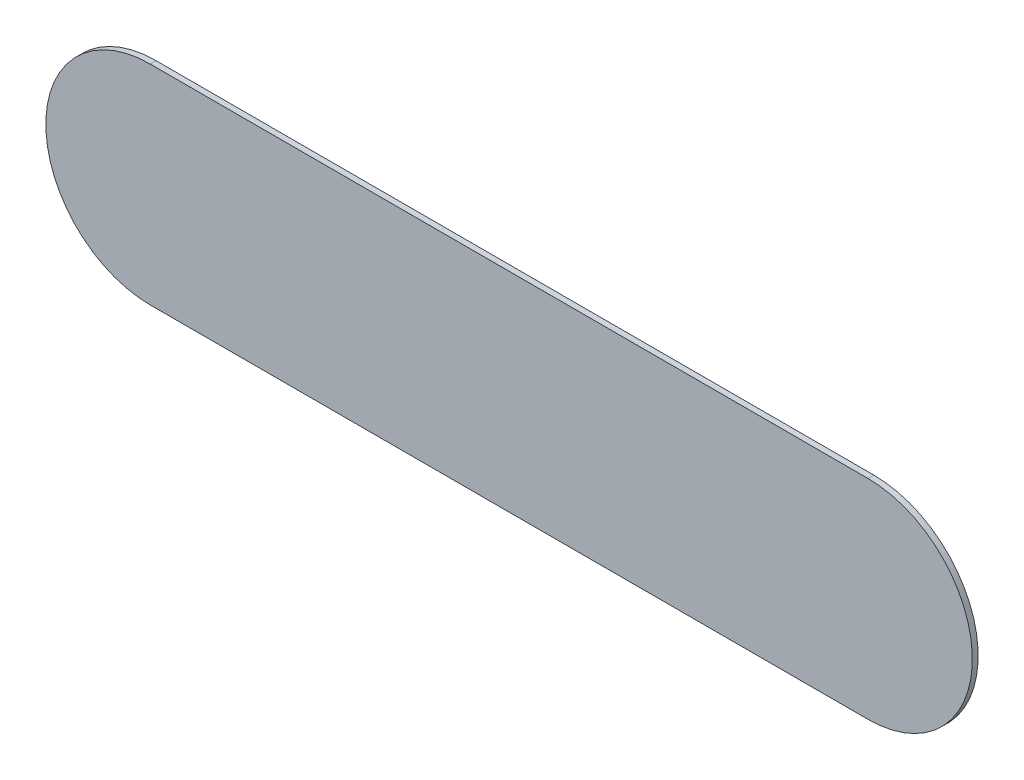
ISO-10303-21;
HEADER;
FILE_DESCRIPTION(('STEP AP214'),'2;1');
FILE_NAME('part.step','',(''),(''),'','','');
FILE_SCHEMA(('AUTOMOTIVE_DESIGN { 1 0 10303 214 1 1 1 1 }'));
ENDSEC;
DATA;
#1=APPLICATION_CONTEXT('core data for automotive mechanical design processes');
#2=APPLICATION_PROTOCOL_DEFINITION('international standard','automotive_design',2000,#1);
#3=PRODUCT_CONTEXT('',#1,'mechanical');
#4=PRODUCT('Part','Part','',(#3));
#5=PRODUCT_RELATED_PRODUCT_CATEGORY('part','',(#4));
#6=PRODUCT_DEFINITION_FORMATION('','',#4);
#7=PRODUCT_DEFINITION_CONTEXT('part definition',#1,'design');
#8=PRODUCT_DEFINITION('design','',#6,#7);
#9=PRODUCT_DEFINITION_SHAPE('','',#8);
#10=(LENGTH_UNIT() NAMED_UNIT(*) SI_UNIT(.MILLI.,.METRE.));
#11=(NAMED_UNIT(*) PLANE_ANGLE_UNIT() SI_UNIT($,.RADIAN.));
#12=(NAMED_UNIT(*) SI_UNIT($,.STERADIAN.) SOLID_ANGLE_UNIT());
#13=UNCERTAINTY_MEASURE_WITH_UNIT(LENGTH_MEASURE(1.E-05),#10,'distance_accuracy_value','');
#14=(GEOMETRIC_REPRESENTATION_CONTEXT(3) GLOBAL_UNCERTAINTY_ASSIGNED_CONTEXT((#13)) GLOBAL_UNIT_ASSIGNED_CONTEXT((#10,
#11,#12)) REPRESENTATION_CONTEXT('',''));
#15=CARTESIAN_POINT('',(0.,0.,0.));
#16=DIRECTION('',(0.,0.,1.));
#17=DIRECTION('',(1.,0.,0.));
#18=AXIS2_PLACEMENT_3D('',#15,#16,#17);
#19=CARTESIAN_POINT('',(116.483,-121.909,1.635));
#20=DIRECTION('',(0.,0.,1.));
#21=DIRECTION('',(1.,0.,0.));
#22=AXIS2_PLACEMENT_3D('',#19,#20,#21);
#23=PLANE('',#22);
#24=DIRECTION('',(1.,0.,0.));
#25=VECTOR('',#24,1.);
#26=CARTESIAN_POINT('',(116.483,-121.909,1.635));
#27=LINE('',#26,#25);
#28=CARTESIAN_POINT('',(116.483,-121.909,1.635));
#29=VERTEX_POINT('',#28);
#30=CARTESIAN_POINT('',(120.784,-121.909,1.635));
#31=VERTEX_POINT('',#30);
#32=EDGE_CURVE('E99',#29,#31,#27,.T.);
#33=ORIENTED_EDGE('',*,*,#32,.T.);
#34=CARTESIAN_POINT('',(120.784,-121.284,1.635));
#35=DIRECTION('',(0.,0.,1.));
#36=DIRECTION('',(0.,-1.,0.));
#37=AXIS2_PLACEMENT_3D('',#34,#35,#36);
#38=CIRCLE('',#37,0.625);
#39=CARTESIAN_POINT('',(120.784,-120.659,1.635));
#40=VERTEX_POINT('',#39);
#41=EDGE_CURVE('E78',#31,#40,#38,.T.);
#42=ORIENTED_EDGE('',*,*,#41,.T.);
#43=DIRECTION('',(-1.,0.,0.));
#44=VECTOR('',#43,1.);
#45=CARTESIAN_POINT('',(120.784,-120.659,1.635));
#46=LINE('',#45,#44);
#47=CARTESIAN_POINT('',(116.483,-120.659,1.635));
#48=VERTEX_POINT('',#47);
#49=EDGE_CURVE('E83',#40,#48,#46,.T.);
#50=ORIENTED_EDGE('',*,*,#49,.T.);
#51=CARTESIAN_POINT('',(116.483,-121.284,1.635));
#52=DIRECTION('',(0.,0.,1.));
#53=DIRECTION('',(0.,1.,0.));
#54=AXIS2_PLACEMENT_3D('',#51,#52,#53);
#55=CIRCLE('',#54,0.625);
#56=EDGE_CURVE('E11',#48,#29,#55,.T.);
#57=ORIENTED_EDGE('',*,*,#56,.T.);
#58=EDGE_LOOP('',(#33,#42,#50,#57));
#59=FACE_BOUND('',#58,.T.);
#60=ADVANCED_FACE('F17',(#59),#23,.T.);
#61=CARTESIAN_POINT('',(116.483,-121.909,1.6));
#62=DIRECTION('',(0.,0.,1.));
#63=DIRECTION('',(1.,0.,0.));
#64=AXIS2_PLACEMENT_3D('',#61,#62,#63);
#65=PLANE('',#64);
#66=CARTESIAN_POINT('',(116.483,-121.284,1.6));
#67=DIRECTION('',(0.,0.,1.));
#68=DIRECTION('',(0.,1.,0.));
#69=AXIS2_PLACEMENT_3D('',#66,#67,#68);
#70=CIRCLE('',#69,0.625);
#71=CARTESIAN_POINT('',(116.483,-120.659,1.6));
#72=VERTEX_POINT('',#71);
#73=CARTESIAN_POINT('',(116.483,-121.909,1.6));
#74=VERTEX_POINT('',#73);
#75=EDGE_CURVE('E26',#72,#74,#70,.T.);
#76=ORIENTED_EDGE('',*,*,#75,.F.);
#77=DIRECTION('',(-1.,0.,0.));
#78=VECTOR('',#77,1.);
#79=CARTESIAN_POINT('',(120.784,-120.659,1.6));
#80=LINE('',#79,#78);
#81=CARTESIAN_POINT('',(120.784,-120.659,1.6));
#82=VERTEX_POINT('',#81);
#83=EDGE_CURVE('E68',#82,#72,#80,.T.);
#84=ORIENTED_EDGE('',*,*,#83,.F.);
#85=CARTESIAN_POINT('',(120.784,-121.284,1.6));
#86=DIRECTION('',(0.,0.,1.));
#87=DIRECTION('',(0.,-1.,0.));
#88=AXIS2_PLACEMENT_3D('',#85,#86,#87);
#89=CIRCLE('',#88,0.625);
#90=CARTESIAN_POINT('',(120.784,-121.909,1.6));
#91=VERTEX_POINT('',#90);
#92=EDGE_CURVE('E72',#91,#82,#89,.T.);
#93=ORIENTED_EDGE('',*,*,#92,.F.);
#94=DIRECTION('',(1.,0.,0.));
#95=VECTOR('',#94,1.);
#96=CARTESIAN_POINT('',(116.483,-121.909,1.6));
#97=LINE('',#96,#95);
#98=EDGE_CURVE('E115',#74,#91,#97,.T.);
#99=ORIENTED_EDGE('',*,*,#98,.F.);
#100=EDGE_LOOP('',(#76,#84,#93,#99));
#101=FACE_BOUND('',#100,.T.);
#102=ADVANCED_FACE('F70',(#101),#65,.F.);
#103=CARTESIAN_POINT('',(116.483,-121.284,1.6));
#104=DIRECTION('',(0.,0.,-1.));
#105=DIRECTION('',(0.,1.,0.));
#106=AXIS2_PLACEMENT_3D('',#103,#104,#105);
#107=CYLINDRICAL_SURFACE('',#106,0.625);
#108=ORIENTED_EDGE('',*,*,#75,.T.);
#109=DIRECTION('',(0.,0.,1.));
#110=VECTOR('',#109,1.);
#111=CARTESIAN_POINT('',(116.483,-121.909,1.6));
#112=LINE('',#111,#110);
#113=EDGE_CURVE('E93',#74,#29,#112,.T.);
#114=ORIENTED_EDGE('',*,*,#113,.T.);
#115=ORIENTED_EDGE('',*,*,#56,.F.);
#116=DIRECTION('',(0.,0.,1.));
#117=VECTOR('',#116,1.);
#118=CARTESIAN_POINT('',(116.483,-120.659,1.6));
#119=LINE('',#118,#117);
#120=EDGE_CURVE('E77',#72,#48,#119,.T.);
#121=ORIENTED_EDGE('',*,*,#120,.F.);
#122=EDGE_LOOP('',(#108,#114,#115,#121));
#123=FACE_BOUND('',#122,.T.);
#124=ADVANCED_FACE('F19',(#123),#107,.T.);
#125=CARTESIAN_POINT('',(120.784,-120.659,1.6));
#126=DIRECTION('',(0.,-1.,0.));
#127=DIRECTION('',(0.,0.,-1.));
#128=AXIS2_PLACEMENT_3D('',#125,#126,#127);
#129=PLANE('',#128);
#130=ORIENTED_EDGE('',*,*,#83,.T.);
#131=ORIENTED_EDGE('',*,*,#120,.T.);
#132=ORIENTED_EDGE('',*,*,#49,.F.);
#133=DIRECTION('',(0.,0.,1.));
#134=VECTOR('',#133,1.);
#135=CARTESIAN_POINT('',(120.784,-120.659,1.6));
#136=LINE('',#135,#134);
#137=EDGE_CURVE('E81',#82,#40,#136,.T.);
#138=ORIENTED_EDGE('',*,*,#137,.F.);
#139=EDGE_LOOP('',(#130,#131,#132,#138));
#140=FACE_BOUND('',#139,.T.);
#141=ADVANCED_FACE('F82',(#140),#129,.F.);
#142=CARTESIAN_POINT('',(120.784,-121.284,1.6));
#143=DIRECTION('',(0.,0.,-1.));
#144=DIRECTION('',(0.,-1.,0.));
#145=AXIS2_PLACEMENT_3D('',#142,#143,#144);
#146=CYLINDRICAL_SURFACE('',#145,0.625);
#147=ORIENTED_EDGE('',*,*,#92,.T.);
#148=ORIENTED_EDGE('',*,*,#137,.T.);
#149=ORIENTED_EDGE('',*,*,#41,.F.);
#150=DIRECTION('',(0.,0.,1.));
#151=VECTOR('',#150,1.);
#152=CARTESIAN_POINT('',(120.784,-121.909,1.6));
#153=LINE('',#152,#151);
#154=EDGE_CURVE('E90',#91,#31,#153,.T.);
#155=ORIENTED_EDGE('',*,*,#154,.F.);
#156=EDGE_LOOP('',(#147,#148,#149,#155));
#157=FACE_BOUND('',#156,.T.);
#158=ADVANCED_FACE('F88',(#157),#146,.T.);
#159=CARTESIAN_POINT('',(116.483,-121.909,1.6));
#160=DIRECTION('',(0.,1.,0.));
#161=DIRECTION('',(1.,0.,0.));
#162=AXIS2_PLACEMENT_3D('',#159,#160,#161);
#163=PLANE('',#162);
#164=ORIENTED_EDGE('',*,*,#98,.T.);
#165=ORIENTED_EDGE('',*,*,#154,.T.);
#166=ORIENTED_EDGE('',*,*,#32,.F.);
#167=ORIENTED_EDGE('',*,*,#113,.F.);
#168=EDGE_LOOP('',(#164,#165,#166,#167));
#169=FACE_BOUND('',#168,.T.);
#170=ADVANCED_FACE('F114',(#169),#163,.F.);
#171=CLOSED_SHELL('',(#60,#102,#124,#141,#158,#170));
#172=MANIFOLD_SOLID_BREP('B1',#171);
#173=ADVANCED_BREP_SHAPE_REPRESENTATION('',(#18,#172),#14);
#174=SHAPE_DEFINITION_REPRESENTATION(#9,#173);
ENDSEC;
END-ISO-10303-21;
